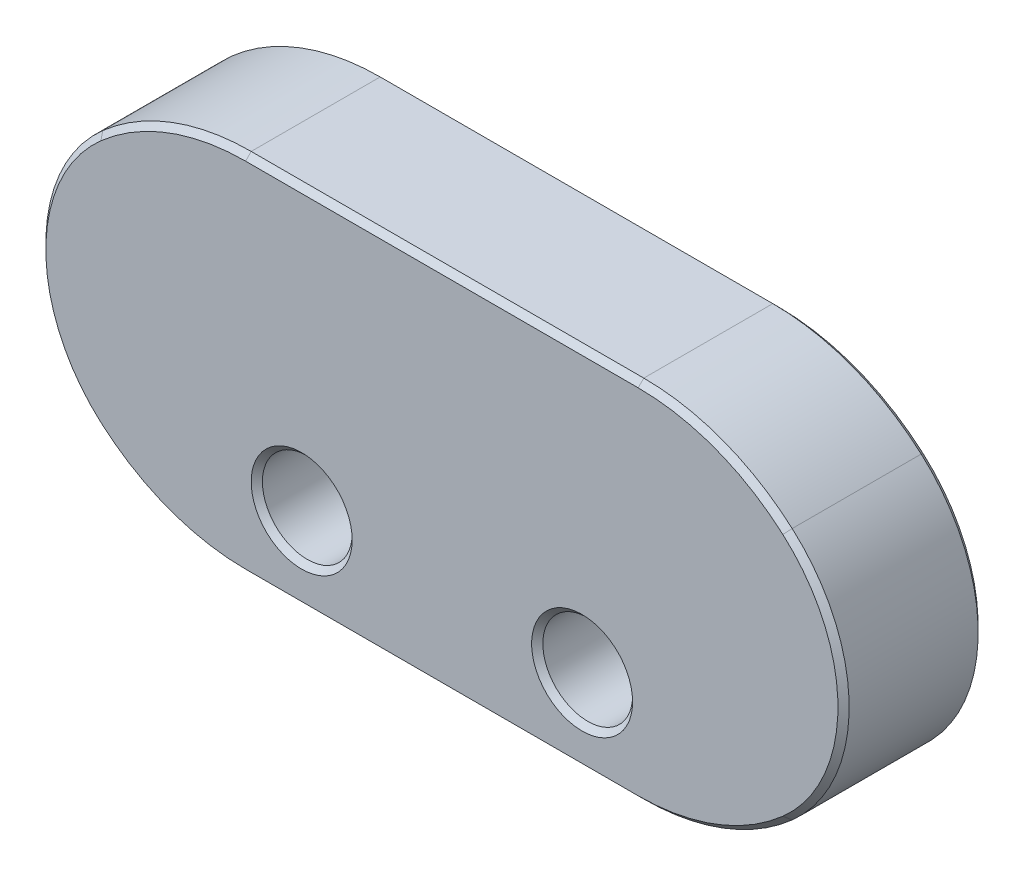
ISO-10303-21;
HEADER;
FILE_DESCRIPTION(('STEP AP214'),'2;1');
FILE_NAME('part.step','',(''),(''),'','','');
FILE_SCHEMA(('AUTOMOTIVE_DESIGN { 1 0 10303 214 1 1 1 1 }'));
ENDSEC;
DATA;
#1=APPLICATION_CONTEXT('core data for automotive mechanical design processes');
#2=APPLICATION_PROTOCOL_DEFINITION('international standard','automotive_design',2000,#1);
#3=PRODUCT_CONTEXT('',#1,'mechanical');
#4=PRODUCT('Part','Part','',(#3));
#5=PRODUCT_RELATED_PRODUCT_CATEGORY('part','',(#4));
#6=PRODUCT_DEFINITION_FORMATION('','',#4);
#7=PRODUCT_DEFINITION_CONTEXT('part definition',#1,'design');
#8=PRODUCT_DEFINITION('design','',#6,#7);
#9=PRODUCT_DEFINITION_SHAPE('','',#8);
#10=(LENGTH_UNIT() NAMED_UNIT(*) SI_UNIT(.MILLI.,.METRE.));
#11=(NAMED_UNIT(*) PLANE_ANGLE_UNIT() SI_UNIT($,.RADIAN.));
#12=(NAMED_UNIT(*) SI_UNIT($,.STERADIAN.) SOLID_ANGLE_UNIT());
#13=UNCERTAINTY_MEASURE_WITH_UNIT(LENGTH_MEASURE(1.E-05),#10,'distance_accuracy_value','');
#14=(GEOMETRIC_REPRESENTATION_CONTEXT(3) GLOBAL_UNCERTAINTY_ASSIGNED_CONTEXT((#13)) GLOBAL_UNIT_ASSIGNED_CONTEXT((#10,
#11,#12)) REPRESENTATION_CONTEXT('',''));
#15=CARTESIAN_POINT('',(0.,0.,0.));
#16=DIRECTION('',(0.,0.,1.));
#17=DIRECTION('',(1.,0.,0.));
#18=AXIS2_PLACEMENT_3D('',#15,#16,#17);
#19=CARTESIAN_POINT('',(0.,-13.,5.));
#20=DIRECTION('',(0.,1.,0.));
#21=DIRECTION('',(0.,0.,1.));
#22=AXIS2_PLACEMENT_3D('',#19,#20,#21);
#23=PLANE('',#22);
#24=DIRECTION('',(0.,0.,-1.));
#25=VECTOR('',#24,1.);
#26=CARTESIAN_POINT('',(22.,-13.,5.));
#27=LINE('',#26,#25);
#28=CARTESIAN_POINT('',(22.,-13.,0.199999999999995));
#29=VERTEX_POINT('',#28);
#30=CARTESIAN_POINT('',(22.,-13.,4.8));
#31=VERTEX_POINT('',#30);
#32=EDGE_CURVE('E322',#29,#31,#27,.F.);
#33=ORIENTED_EDGE('',*,*,#32,.T.);
#34=DIRECTION('',(-1.,0.,0.));
#35=VECTOR('',#34,1.);
#36=CARTESIAN_POINT('',(8.,-13.,4.8));
#37=LINE('',#36,#35);
#38=CARTESIAN_POINT('',(8.,-13.,4.8));
#39=VERTEX_POINT('',#38);
#40=EDGE_CURVE('E156',#31,#39,#37,.T.);
#41=ORIENTED_EDGE('',*,*,#40,.T.);
#42=DIRECTION('',(0.,0.,-1.));
#43=VECTOR('',#42,1.);
#44=CARTESIAN_POINT('',(8.,-13.,5.));
#45=LINE('',#44,#43);
#46=CARTESIAN_POINT('',(8.,-13.,0.199999999999995));
#47=VERTEX_POINT('',#46);
#48=EDGE_CURVE('E327',#39,#47,#45,.T.);
#49=ORIENTED_EDGE('',*,*,#48,.T.);
#50=DIRECTION('',(1.,0.,0.));
#51=VECTOR('',#50,1.);
#52=CARTESIAN_POINT('',(0.,-13.,0.199999999999995));
#53=LINE('',#52,#51);
#54=EDGE_CURVE('E176',#47,#29,#53,.T.);
#55=ORIENTED_EDGE('',*,*,#54,.T.);
#56=EDGE_LOOP('',(#33,#41,#49,#55));
#57=FACE_BOUND('',#56,.T.);
#58=ADVANCED_FACE('F35',(#57),#23,.F.);
#59=CARTESIAN_POINT('',(0.,0.,5.));
#60=DIRECTION('',(0.,-1.,0.));
#61=DIRECTION('',(0.,0.,-1.));
#62=AXIS2_PLACEMENT_3D('',#59,#60,#61);
#63=PLANE('',#62);
#64=DIRECTION('',(0.,0.,-1.));
#65=VECTOR('',#64,1.);
#66=CARTESIAN_POINT('',(8.,0.,5.));
#67=LINE('',#66,#65);
#68=CARTESIAN_POINT('',(8.,0.,0.199999999999995));
#69=VERTEX_POINT('',#68);
#70=CARTESIAN_POINT('',(8.,0.,4.8));
#71=VERTEX_POINT('',#70);
#72=EDGE_CURVE('E320',#69,#71,#67,.F.);
#73=ORIENTED_EDGE('',*,*,#72,.T.);
#74=DIRECTION('',(1.,0.,0.));
#75=VECTOR('',#74,1.);
#76=CARTESIAN_POINT('',(22.,0.,4.8));
#77=LINE('',#76,#75);
#78=CARTESIAN_POINT('',(22.,0.,4.8));
#79=VERTEX_POINT('',#78);
#80=EDGE_CURVE('E199',#71,#79,#77,.T.);
#81=ORIENTED_EDGE('',*,*,#80,.T.);
#82=DIRECTION('',(0.,0.,-1.));
#83=VECTOR('',#82,1.);
#84=CARTESIAN_POINT('',(22.,0.,5.));
#85=LINE('',#84,#83);
#86=CARTESIAN_POINT('',(22.,0.,0.199999999999995));
#87=VERTEX_POINT('',#86);
#88=EDGE_CURVE('E260',#79,#87,#85,.T.);
#89=ORIENTED_EDGE('',*,*,#88,.T.);
#90=DIRECTION('',(-1.,0.,0.));
#91=VECTOR('',#90,1.);
#92=CARTESIAN_POINT('',(0.,0.,0.199999999999995));
#93=LINE('',#92,#91);
#94=EDGE_CURVE('E196',#87,#69,#93,.T.);
#95=ORIENTED_EDGE('',*,*,#94,.T.);
#96=EDGE_LOOP('',(#73,#81,#89,#95));
#97=FACE_BOUND('',#96,.T.);
#98=ADVANCED_FACE('F317',(#97),#63,.F.);
#99=CARTESIAN_POINT('',(0.,0.,5.));
#100=DIRECTION('',(0.,0.,1.));
#101=DIRECTION('',(1.,0.,0.));
#102=AXIS2_PLACEMENT_3D('',#99,#100,#101);
#103=PLANE('',#102);
#104=CARTESIAN_POINT('',(8.,-5.,5.));
#105=DIRECTION('',(0.,0.,1.));
#106=DIRECTION('',(1.,0.,0.));
#107=AXIS2_PLACEMENT_3D('',#104,#105,#106);
#108=CIRCLE('',#107,7.8);
#109=CARTESIAN_POINT('',(2.84078494342405,-10.85,5.));
#110=VERTEX_POINT('',#109);
#111=CARTESIAN_POINT('',(8.,-12.8,5.));
#112=VERTEX_POINT('',#111);
#113=EDGE_CURVE('E174',#110,#112,#108,.T.);
#114=ORIENTED_EDGE('',*,*,#113,.T.);
#115=DIRECTION('',(1.,0.,0.));
#116=VECTOR('',#115,1.);
#117=CARTESIAN_POINT('',(22.,-12.8,5.));
#118=LINE('',#117,#116);
#119=CARTESIAN_POINT('',(22.,-12.8,5.));
#120=VERTEX_POINT('',#119);
#121=EDGE_CURVE('E154',#112,#120,#118,.T.);
#122=ORIENTED_EDGE('',*,*,#121,.T.);
#123=CARTESIAN_POINT('',(22.,-5.,5.));
#124=DIRECTION('',(0.,0.,1.));
#125=DIRECTION('',(1.,0.,0.));
#126=AXIS2_PLACEMENT_3D('',#123,#124,#125);
#127=CIRCLE('',#126,7.8);
#128=CARTESIAN_POINT('',(27.159215056576,-10.85,5.));
#129=VERTEX_POINT('',#128);
#130=EDGE_CURVE('E162',#120,#129,#127,.T.);
#131=ORIENTED_EDGE('',*,*,#130,.T.);
#132=CARTESIAN_POINT('',(23.3228756555323,-6.5,5.));
#133=DIRECTION('',(0.,0.,1.));
#134=DIRECTION('',(1.,0.,0.));
#135=AXIS2_PLACEMENT_3D('',#132,#133,#134);
#136=CIRCLE('',#135,5.8);
#137=CARTESIAN_POINT('',(27.159215056576,-2.15,5.));
#138=VERTEX_POINT('',#137);
#139=EDGE_CURVE('E168',#129,#138,#136,.T.);
#140=ORIENTED_EDGE('',*,*,#139,.T.);
#141=CARTESIAN_POINT('',(22.,-8.,5.));
#142=DIRECTION('',(0.,0.,1.));
#143=DIRECTION('',(1.,0.,0.));
#144=AXIS2_PLACEMENT_3D('',#141,#142,#143);
#145=CIRCLE('',#144,7.8);
#146=CARTESIAN_POINT('',(22.,-0.199999999999999,5.));
#147=VERTEX_POINT('',#146);
#148=EDGE_CURVE('E346',#138,#147,#145,.T.);
#149=ORIENTED_EDGE('',*,*,#148,.T.);
#150=DIRECTION('',(-1.,0.,0.));
#151=VECTOR('',#150,1.);
#152=CARTESIAN_POINT('',(8.,-0.199999999999999,5.));
#153=LINE('',#152,#151);
#154=CARTESIAN_POINT('',(8.,-0.199999999999999,5.));
#155=VERTEX_POINT('',#154);
#156=EDGE_CURVE('E348',#147,#155,#153,.T.);
#157=ORIENTED_EDGE('',*,*,#156,.T.);
#158=CARTESIAN_POINT('',(8.,-8.,5.));
#159=DIRECTION('',(0.,0.,1.));
#160=DIRECTION('',(1.,0.,0.));
#161=AXIS2_PLACEMENT_3D('',#158,#159,#160);
#162=CIRCLE('',#161,7.8);
#163=CARTESIAN_POINT('',(2.84078494342405,-2.15,5.));
#164=VERTEX_POINT('',#163);
#165=EDGE_CURVE('E350',#155,#164,#162,.T.);
#166=ORIENTED_EDGE('',*,*,#165,.T.);
#167=CARTESIAN_POINT('',(6.67712434446771,-6.5,5.));
#168=DIRECTION('',(0.,0.,1.));
#169=DIRECTION('',(1.,0.,0.));
#170=AXIS2_PLACEMENT_3D('',#167,#168,#169);
#171=CIRCLE('',#170,5.8);
#172=EDGE_CURVE('E179',#164,#110,#171,.T.);
#173=ORIENTED_EDGE('',*,*,#172,.T.);
#174=EDGE_LOOP('',(#114,#122,#131,#140,#149,#157,#166,#173));
#175=FACE_BOUND('',#174,.T.);
#176=CARTESIAN_POINT('',(20.,-10.,5.));
#177=DIRECTION('',(0.,0.,1.));
#178=DIRECTION('',(1.,0.,0.));
#179=AXIS2_PLACEMENT_3D('',#176,#177,#178);
#180=CIRCLE('',#179,1.8);
#181=CARTESIAN_POINT('',(21.8,-10.,5.));
#182=VERTEX_POINT('',#181);
#183=EDGE_CURVE('E169',#182,#182,#180,.F.);
#184=ORIENTED_EDGE('',*,*,#183,.T.);
#185=EDGE_LOOP('',(#184));
#186=FACE_BOUND('',#185,.T.);
#187=CARTESIAN_POINT('',(10.,-10.,5.));
#188=DIRECTION('',(0.,0.,1.));
#189=DIRECTION('',(1.,0.,0.));
#190=AXIS2_PLACEMENT_3D('',#187,#188,#189);
#191=CIRCLE('',#190,1.8);
#192=CARTESIAN_POINT('',(11.8,-10.,5.));
#193=VERTEX_POINT('',#192);
#194=EDGE_CURVE('E340',#193,#193,#191,.F.);
#195=ORIENTED_EDGE('',*,*,#194,.T.);
#196=EDGE_LOOP('',(#195));
#197=FACE_BOUND('',#196,.T.);
#198=ADVANCED_FACE('F171',(#175,#186,#197),#103,.T.);
#199=CARTESIAN_POINT('',(0.,0.,0.));
#200=DIRECTION('',(0.,0.,1.));
#201=DIRECTION('',(1.,0.,0.));
#202=AXIS2_PLACEMENT_3D('',#199,#200,#201);
#203=PLANE('',#202);
#204=CARTESIAN_POINT('',(8.,-8.,0.));
#205=DIRECTION('',(0.,0.,1.));
#206=DIRECTION('',(1.,0.,0.));
#207=AXIS2_PLACEMENT_3D('',#204,#205,#206);
#208=CIRCLE('',#207,7.80000000000001);
#209=CARTESIAN_POINT('',(2.84078494342404,-2.15,0.));
#210=VERTEX_POINT('',#209);
#211=CARTESIAN_POINT('',(8.,-0.199999999999994,0.));
#212=VERTEX_POINT('',#211);
#213=EDGE_CURVE('E45',#210,#212,#208,.F.);
#214=ORIENTED_EDGE('',*,*,#213,.T.);
#215=DIRECTION('',(1.,0.,0.));
#216=VECTOR('',#215,1.);
#217=CARTESIAN_POINT('',(0.,-0.199999999999994,0.));
#218=LINE('',#217,#216);
#219=CARTESIAN_POINT('',(22.,-0.199999999999994,0.));
#220=VERTEX_POINT('',#219);
#221=EDGE_CURVE('E11',#212,#220,#218,.T.);
#222=ORIENTED_EDGE('',*,*,#221,.T.);
#223=CARTESIAN_POINT('',(22.,-8.,0.));
#224=DIRECTION('',(0.,0.,1.));
#225=DIRECTION('',(1.,0.,0.));
#226=AXIS2_PLACEMENT_3D('',#223,#224,#225);
#227=CIRCLE('',#226,7.80000000000001);
#228=CARTESIAN_POINT('',(27.159215056576,-2.15,0.));
#229=VERTEX_POINT('',#228);
#230=EDGE_CURVE('E231',#220,#229,#227,.F.);
#231=ORIENTED_EDGE('',*,*,#230,.T.);
#232=CARTESIAN_POINT('',(23.3228756555323,-6.5,0.));
#233=DIRECTION('',(0.,0.,1.));
#234=DIRECTION('',(1.,0.,0.));
#235=AXIS2_PLACEMENT_3D('',#232,#233,#234);
#236=CIRCLE('',#235,5.80000000000001);
#237=CARTESIAN_POINT('',(27.159215056576,-10.85,0.));
#238=VERTEX_POINT('',#237);
#239=EDGE_CURVE('E233',#229,#238,#236,.F.);
#240=ORIENTED_EDGE('',*,*,#239,.T.);
#241=CARTESIAN_POINT('',(22.,-5.,0.));
#242=DIRECTION('',(0.,0.,1.));
#243=DIRECTION('',(1.,0.,0.));
#244=AXIS2_PLACEMENT_3D('',#241,#242,#243);
#245=CIRCLE('',#244,7.80000000000001);
#246=CARTESIAN_POINT('',(22.,-12.8,0.));
#247=VERTEX_POINT('',#246);
#248=EDGE_CURVE('E235',#238,#247,#245,.F.);
#249=ORIENTED_EDGE('',*,*,#248,.T.);
#250=DIRECTION('',(-1.,0.,0.));
#251=VECTOR('',#250,1.);
#252=CARTESIAN_POINT('',(0.,-12.8,0.));
#253=LINE('',#252,#251);
#254=CARTESIAN_POINT('',(8.,-12.8,0.));
#255=VERTEX_POINT('',#254);
#256=EDGE_CURVE('E237',#247,#255,#253,.T.);
#257=ORIENTED_EDGE('',*,*,#256,.T.);
#258=CARTESIAN_POINT('',(8.,-5.,0.));
#259=DIRECTION('',(0.,0.,1.));
#260=DIRECTION('',(1.,0.,0.));
#261=AXIS2_PLACEMENT_3D('',#258,#259,#260);
#262=CIRCLE('',#261,7.80000000000001);
#263=CARTESIAN_POINT('',(2.84078494342405,-10.85,0.));
#264=VERTEX_POINT('',#263);
#265=EDGE_CURVE('E239',#255,#264,#262,.F.);
#266=ORIENTED_EDGE('',*,*,#265,.T.);
#267=CARTESIAN_POINT('',(6.67712434446771,-6.5,0.));
#268=DIRECTION('',(0.,0.,1.));
#269=DIRECTION('',(1.,0.,0.));
#270=AXIS2_PLACEMENT_3D('',#267,#268,#269);
#271=CIRCLE('',#270,5.80000000000001);
#272=EDGE_CURVE('E56',#264,#210,#271,.F.);
#273=ORIENTED_EDGE('',*,*,#272,.T.);
#274=EDGE_LOOP('',(#214,#222,#231,#240,#249,#257,#266,#273));
#275=FACE_BOUND('',#274,.T.);
#276=CARTESIAN_POINT('',(20.,-10.,0.));
#277=DIRECTION('',(0.,0.,1.));
#278=DIRECTION('',(1.,0.,0.));
#279=AXIS2_PLACEMENT_3D('',#276,#277,#278);
#280=CIRCLE('',#279,1.79999999999999);
#281=CARTESIAN_POINT('',(21.8,-10.,0.));
#282=VERTEX_POINT('',#281);
#283=EDGE_CURVE('E228',#282,#282,#280,.T.);
#284=ORIENTED_EDGE('',*,*,#283,.T.);
#285=EDGE_LOOP('',(#284));
#286=FACE_BOUND('',#285,.T.);
#287=CARTESIAN_POINT('',(10.,-10.,0.));
#288=DIRECTION('',(0.,0.,1.));
#289=DIRECTION('',(1.,0.,0.));
#290=AXIS2_PLACEMENT_3D('',#287,#288,#289);
#291=CIRCLE('',#290,1.79999999999999);
#292=CARTESIAN_POINT('',(8.20000000000001,-10.,0.));
#293=VERTEX_POINT('',#292);
#294=EDGE_CURVE('E225',#293,#293,#291,.T.);
#295=ORIENTED_EDGE('',*,*,#294,.T.);
#296=EDGE_LOOP('',(#295));
#297=FACE_BOUND('',#296,.T.);
#298=ADVANCED_FACE('F293',(#275,#286,#297),#203,.F.);
#299=CARTESIAN_POINT('',(20.,-10.,5.));
#300=DIRECTION('',(0.,0.,-1.));
#301=DIRECTION('',(-1.,0.,0.));
#302=AXIS2_PLACEMENT_3D('',#299,#300,#301);
#303=CYLINDRICAL_SURFACE('',#302,1.6);
#304=CARTESIAN_POINT('',(20.,-10.,4.80000000000001));
#305=DIRECTION('',(0.,0.,1.));
#306=DIRECTION('',(1.,0.,0.));
#307=AXIS2_PLACEMENT_3D('',#304,#305,#306);
#308=CIRCLE('',#307,1.6);
#309=CARTESIAN_POINT('',(21.6,-10.,4.80000000000001));
#310=VERTEX_POINT('',#309);
#311=EDGE_CURVE('E216',#310,#310,#308,.T.);
#312=ORIENTED_EDGE('',*,*,#311,.T.);
#313=EDGE_LOOP('',(#312));
#314=FACE_BOUND('',#313,.T.);
#315=CARTESIAN_POINT('',(20.,-10.,0.199999999999993));
#316=DIRECTION('',(0.,0.,1.));
#317=DIRECTION('',(1.,0.,0.));
#318=AXIS2_PLACEMENT_3D('',#315,#316,#317);
#319=CIRCLE('',#318,1.6);
#320=CARTESIAN_POINT('',(21.6,-10.,0.199999999999993));
#321=VERTEX_POINT('',#320);
#322=EDGE_CURVE('E213',#321,#321,#319,.F.);
#323=ORIENTED_EDGE('',*,*,#322,.T.);
#324=EDGE_LOOP('',(#323));
#325=FACE_BOUND('',#324,.T.);
#326=ADVANCED_FACE('F491',(#314,#325),#303,.F.);
#327=CARTESIAN_POINT('',(10.,-10.,5.));
#328=DIRECTION('',(0.,0.,-1.));
#329=DIRECTION('',(-1.,0.,0.));
#330=AXIS2_PLACEMENT_3D('',#327,#328,#329);
#331=CYLINDRICAL_SURFACE('',#330,1.6);
#332=CARTESIAN_POINT('',(10.,-10.,4.80000000000001));
#333=DIRECTION('',(0.,0.,1.));
#334=DIRECTION('',(1.,0.,0.));
#335=AXIS2_PLACEMENT_3D('',#332,#333,#334);
#336=CIRCLE('',#335,1.6);
#337=CARTESIAN_POINT('',(8.4,-10.,4.80000000000001));
#338=VERTEX_POINT('',#337);
#339=EDGE_CURVE('E222',#338,#338,#336,.T.);
#340=CARTESIAN_POINT('',(10.,-10.,0.199999999999994));
#341=DIRECTION('',(0.,0.,1.));
#342=DIRECTION('',(1.,0.,0.));
#343=AXIS2_PLACEMENT_3D('',#340,#341,#342);
#344=CIRCLE('',#343,1.6);
#345=CARTESIAN_POINT('',(8.4,-10.,0.199999999999994));
#346=VERTEX_POINT('',#345);
#347=EDGE_CURVE('E219',#346,#346,#344,.F.);
#348=CARTESIAN_POINT('',(8.4,-10.,4.80000000000001));
#349=CARTESIAN_POINT('',(8.4,-10.,4.75208333333334));
#350=CARTESIAN_POINT('',(8.4,-10.,4.70416666666667));
#351=CARTESIAN_POINT('',(8.4,-10.,4.60833333333334));
#352=CARTESIAN_POINT('',(8.4,-10.,4.56041666666667));
#353=CARTESIAN_POINT('',(8.4,-10.,4.46458333333334));
#354=CARTESIAN_POINT('',(8.4,-10.,4.41666666666667));
#355=CARTESIAN_POINT('',(8.4,-10.,4.32083333333334));
#356=CARTESIAN_POINT('',(8.4,-10.,4.27291666666667));
#357=CARTESIAN_POINT('',(8.4,-10.,4.17708333333334));
#358=CARTESIAN_POINT('',(8.4,-10.,4.12916666666667));
#359=CARTESIAN_POINT('',(8.4,-10.,4.03333333333334));
#360=CARTESIAN_POINT('',(8.4,-10.,3.98541666666667));
#361=CARTESIAN_POINT('',(8.4,-10.,3.88958333333334));
#362=CARTESIAN_POINT('',(8.4,-10.,3.84166666666667));
#363=CARTESIAN_POINT('',(8.4,-10.,3.74583333333334));
#364=CARTESIAN_POINT('',(8.4,-10.,3.69791666666667));
#365=CARTESIAN_POINT('',(8.4,-10.,3.60208333333334));
#366=CARTESIAN_POINT('',(8.4,-10.,3.55416666666667));
#367=CARTESIAN_POINT('',(8.4,-10.,3.45833333333334));
#368=CARTESIAN_POINT('',(8.4,-10.,3.41041666666667));
#369=CARTESIAN_POINT('',(8.4,-10.,3.31458333333333));
#370=CARTESIAN_POINT('',(8.4,-10.,3.26666666666667));
#371=CARTESIAN_POINT('',(8.4,-10.,3.17083333333334));
#372=CARTESIAN_POINT('',(8.4,-10.,3.12291666666667));
#373=CARTESIAN_POINT('',(8.4,-10.,3.02708333333333));
#374=CARTESIAN_POINT('',(8.4,-10.,2.97916666666667));
#375=CARTESIAN_POINT('',(8.4,-10.,2.88333333333333));
#376=CARTESIAN_POINT('',(8.4,-10.,2.83541666666667));
#377=CARTESIAN_POINT('',(8.4,-10.,2.73958333333333));
#378=CARTESIAN_POINT('',(8.4,-10.,2.69166666666667));
#379=CARTESIAN_POINT('',(8.4,-10.,2.59583333333333));
#380=CARTESIAN_POINT('',(8.4,-10.,2.54791666666667));
#381=CARTESIAN_POINT('',(8.4,-10.,2.45208333333333));
#382=CARTESIAN_POINT('',(8.4,-10.,2.40416666666667));
#383=CARTESIAN_POINT('',(8.4,-10.,2.30833333333333));
#384=CARTESIAN_POINT('',(8.4,-10.,2.26041666666667));
#385=CARTESIAN_POINT('',(8.4,-10.,2.16458333333333));
#386=CARTESIAN_POINT('',(8.4,-10.,2.11666666666667));
#387=CARTESIAN_POINT('',(8.4,-10.,2.02083333333333));
#388=CARTESIAN_POINT('',(8.4,-10.,1.97291666666667));
#389=CARTESIAN_POINT('',(8.4,-10.,1.87708333333333));
#390=CARTESIAN_POINT('',(8.4,-10.,1.82916666666667));
#391=CARTESIAN_POINT('',(8.4,-10.,1.73333333333333));
#392=CARTESIAN_POINT('',(8.4,-10.,1.68541666666666));
#393=CARTESIAN_POINT('',(8.4,-10.,1.58958333333333));
#394=CARTESIAN_POINT('',(8.4,-10.,1.54166666666666));
#395=CARTESIAN_POINT('',(8.4,-10.,1.44583333333333));
#396=CARTESIAN_POINT('',(8.4,-10.,1.39791666666666));
#397=CARTESIAN_POINT('',(8.4,-10.,1.30208333333333));
#398=CARTESIAN_POINT('',(8.4,-10.,1.25416666666666));
#399=CARTESIAN_POINT('',(8.4,-10.,1.15833333333333));
#400=CARTESIAN_POINT('',(8.4,-10.,1.11041666666666));
#401=CARTESIAN_POINT('',(8.4,-10.,1.01458333333333));
#402=CARTESIAN_POINT('',(8.4,-10.,0.966666666666663));
#403=CARTESIAN_POINT('',(8.4,-10.,0.87083333333333));
#404=CARTESIAN_POINT('',(8.4,-10.,0.822916666666662));
#405=CARTESIAN_POINT('',(8.4,-10.,0.727083333333329));
#406=CARTESIAN_POINT('',(8.4,-10.,0.679166666666662));
#407=CARTESIAN_POINT('',(8.4,-10.,0.583333333333329));
#408=CARTESIAN_POINT('',(8.4,-10.,0.535416666666662));
#409=CARTESIAN_POINT('',(8.4,-10.,0.439583333333329));
#410=CARTESIAN_POINT('',(8.4,-10.,0.391666666666663));
#411=CARTESIAN_POINT('',(8.4,-10.,0.295833333333329));
#412=CARTESIAN_POINT('',(8.4,-10.,0.247916666666662));
#413=CARTESIAN_POINT('',(8.4,-10.,0.199999999999994));
#414=B_SPLINE_CURVE_WITH_KNOTS('',3,(#348,#349,#350,#351,#352,#353,#354,#355,#356,#357,#358,
#359,#360,#361,#362,#363,#364,#365,#366,#367,#368,#369,#370,#371,#372,#373,#374,#375,#376,#377,
#378,#379,#380,#381,#382,#383,#384,#385,#386,#387,#388,#389,#390,#391,#392,#393,#394,#395,#396,
#397,#398,#399,#400,#401,#402,#403,#404,#405,#406,#407,#408,#409,#410,#411,#412,#413),
.UNSPECIFIED.,.F.,.F.,(4,2,2,2,2,2,2,2,2,2,2,2,2,2,2,2,2,2,2,2,2,2,2,2,2,2,2,2,2,2,2,2,4),(0.,
0.143750000000001,0.287500000000001,0.431250000000001,0.575000000000002,0.718750000000002,
0.862500000000002,1.00625,1.15,1.29375,1.4375,1.58125,1.725,1.86875,2.01250000000001,
2.15625000000001,2.30000000000001,2.44375000000001,2.58750000000001,2.73125000000001,
2.87500000000001,3.01875000000001,3.16250000000001,3.30625000000001,3.45000000000001,
3.59375000000001,3.73750000000001,3.88125000000001,4.02500000000001,4.16875000000001,
4.31250000000001,4.45625000000001,4.60000000000001),.UNSPECIFIED.);
#415=EDGE_CURVE('BSEAM402',#338,#346,#414,.T.);
#416=ORIENTED_EDGE('',*,*,#339,.T.);
#417=ORIENTED_EDGE('',*,*,#347,.T.);
#418=ORIENTED_EDGE('',*,*,#415,.T.);
#419=ORIENTED_EDGE('',*,*,#415,.F.);
#420=EDGE_LOOP('',(#416,#418,#417,#419));
#421=FACE_BOUND('',#420,.T.);
#422=ADVANCED_FACE('F402',(#421),#331,.F.);
#423=CARTESIAN_POINT('',(8.,-5.,5.));
#424=DIRECTION('',(0.,0.,-1.));
#425=DIRECTION('',(-1.,0.,0.));
#426=AXIS2_PLACEMENT_3D('',#423,#424,#425);
#427=CYLINDRICAL_SURFACE('',#426,8.);
#428=ORIENTED_EDGE('',*,*,#48,.F.);
#429=CARTESIAN_POINT('',(8.,-5.,4.8));
#430=DIRECTION('',(0.,0.,1.));
#431=DIRECTION('',(1.,0.,0.));
#432=AXIS2_PLACEMENT_3D('',#429,#430,#431);
#433=CIRCLE('',#432,8.);
#434=CARTESIAN_POINT('',(2.70849737787082,-11.,4.8));
#435=VERTEX_POINT('',#434);
#436=EDGE_CURVE('E186',#39,#435,#433,.F.);
#437=ORIENTED_EDGE('',*,*,#436,.T.);
#438=DIRECTION('',(0.,0.,-1.));
#439=VECTOR('',#438,1.);
#440=CARTESIAN_POINT('',(2.70849737787082,-11.,5.));
#441=LINE('',#440,#439);
#442=CARTESIAN_POINT('',(2.70849737787082,-11.,0.199999999999995));
#443=VERTEX_POINT('',#442);
#444=EDGE_CURVE('E337',#435,#443,#441,.T.);
#445=ORIENTED_EDGE('',*,*,#444,.T.);
#446=CARTESIAN_POINT('',(8.,-5.,0.199999999999995));
#447=DIRECTION('',(0.,0.,1.));
#448=DIRECTION('',(1.,0.,0.));
#449=AXIS2_PLACEMENT_3D('',#446,#447,#448);
#450=CIRCLE('',#449,8.);
#451=EDGE_CURVE('E184',#443,#47,#450,.T.);
#452=ORIENTED_EDGE('',*,*,#451,.T.);
#453=EDGE_LOOP('',(#428,#437,#445,#452));
#454=FACE_BOUND('',#453,.T.);
#455=ADVANCED_FACE('F366',(#454),#427,.T.);
#456=CARTESIAN_POINT('',(8.,-8.,5.));
#457=DIRECTION('',(0.,0.,-1.));
#458=DIRECTION('',(-1.,0.,0.));
#459=AXIS2_PLACEMENT_3D('',#456,#457,#458);
#460=CYLINDRICAL_SURFACE('',#459,8.);
#461=DIRECTION('',(0.,0.,-1.));
#462=VECTOR('',#461,1.);
#463=CARTESIAN_POINT('',(2.70849737787082,-2.,5.));
#464=LINE('',#463,#462);
#465=CARTESIAN_POINT('',(2.70849737787082,-2.,0.199999999999995));
#466=VERTEX_POINT('',#465);
#467=CARTESIAN_POINT('',(2.70849737787082,-2.,4.8));
#468=VERTEX_POINT('',#467);
#469=EDGE_CURVE('E334',#466,#468,#464,.F.);
#470=ORIENTED_EDGE('',*,*,#469,.T.);
#471=CARTESIAN_POINT('',(8.,-8.,4.8));
#472=DIRECTION('',(0.,0.,1.));
#473=DIRECTION('',(1.,0.,0.));
#474=AXIS2_PLACEMENT_3D('',#471,#472,#473);
#475=CIRCLE('',#474,8.);
#476=EDGE_CURVE('E194',#468,#71,#475,.F.);
#477=ORIENTED_EDGE('',*,*,#476,.T.);
#478=ORIENTED_EDGE('',*,*,#72,.F.);
#479=CARTESIAN_POINT('',(8.,-8.,0.199999999999995));
#480=DIRECTION('',(0.,0.,1.));
#481=DIRECTION('',(1.,0.,0.));
#482=AXIS2_PLACEMENT_3D('',#479,#480,#481);
#483=CIRCLE('',#482,8.);
#484=EDGE_CURVE('E192',#69,#466,#483,.T.);
#485=ORIENTED_EDGE('',*,*,#484,.T.);
#486=EDGE_LOOP('',(#470,#477,#478,#485));
#487=FACE_BOUND('',#486,.T.);
#488=ADVANCED_FACE('F396',(#487),#460,.T.);
#489=CARTESIAN_POINT('',(22.,-8.,5.));
#490=DIRECTION('',(0.,0.,-1.));
#491=DIRECTION('',(-1.,0.,0.));
#492=AXIS2_PLACEMENT_3D('',#489,#490,#491);
#493=CYLINDRICAL_SURFACE('',#492,8.);
#494=ORIENTED_EDGE('',*,*,#88,.F.);
#495=CARTESIAN_POINT('',(22.,-8.,4.8));
#496=DIRECTION('',(0.,0.,1.));
#497=DIRECTION('',(1.,0.,0.));
#498=AXIS2_PLACEMENT_3D('',#495,#496,#497);
#499=CIRCLE('',#498,8.);
#500=CARTESIAN_POINT('',(27.2915026221292,-2.,4.8));
#501=VERTEX_POINT('',#500);
#502=EDGE_CURVE('E203',#79,#501,#499,.F.);
#503=ORIENTED_EDGE('',*,*,#502,.T.);
#504=DIRECTION('',(0.,0.,-1.));
#505=VECTOR('',#504,1.);
#506=CARTESIAN_POINT('',(27.2915026221292,-2.,5.));
#507=LINE('',#506,#505);
#508=CARTESIAN_POINT('',(27.2915026221292,-2.,0.199999999999995));
#509=VERTEX_POINT('',#508);
#510=EDGE_CURVE('E314',#501,#509,#507,.T.);
#511=ORIENTED_EDGE('',*,*,#510,.T.);
#512=CARTESIAN_POINT('',(22.,-8.,0.199999999999995));
#513=DIRECTION('',(0.,0.,1.));
#514=DIRECTION('',(1.,0.,0.));
#515=AXIS2_PLACEMENT_3D('',#512,#513,#514);
#516=CIRCLE('',#515,8.);
#517=EDGE_CURVE('E201',#509,#87,#516,.T.);
#518=ORIENTED_EDGE('',*,*,#517,.T.);
#519=EDGE_LOOP('',(#494,#503,#511,#518));
#520=FACE_BOUND('',#519,.T.);
#521=ADVANCED_FACE('F311',(#520),#493,.T.);
#522=CARTESIAN_POINT('',(22.,-5.,5.));
#523=DIRECTION('',(0.,0.,-1.));
#524=DIRECTION('',(-1.,0.,0.));
#525=AXIS2_PLACEMENT_3D('',#522,#523,#524);
#526=CYLINDRICAL_SURFACE('',#525,8.);
#527=DIRECTION('',(0.,0.,-1.));
#528=VECTOR('',#527,1.);
#529=CARTESIAN_POINT('',(27.2915026221292,-11.,5.));
#530=LINE('',#529,#528);
#531=CARTESIAN_POINT('',(27.2915026221292,-11.,0.199999999999995));
#532=VERTEX_POINT('',#531);
#533=CARTESIAN_POINT('',(27.2915026221292,-11.,4.8));
#534=VERTEX_POINT('',#533);
#535=EDGE_CURVE('E330',#532,#534,#530,.F.);
#536=ORIENTED_EDGE('',*,*,#535,.T.);
#537=CARTESIAN_POINT('',(22.,-5.,4.8));
#538=DIRECTION('',(0.,0.,1.));
#539=DIRECTION('',(1.,0.,0.));
#540=AXIS2_PLACEMENT_3D('',#537,#538,#539);
#541=CIRCLE('',#540,8.);
#542=EDGE_CURVE('E211',#534,#31,#541,.F.);
#543=ORIENTED_EDGE('',*,*,#542,.T.);
#544=ORIENTED_EDGE('',*,*,#32,.F.);
#545=CARTESIAN_POINT('',(22.,-5.,0.199999999999995));
#546=DIRECTION('',(0.,0.,1.));
#547=DIRECTION('',(1.,0.,0.));
#548=AXIS2_PLACEMENT_3D('',#545,#546,#547);
#549=CIRCLE('',#548,8.);
#550=EDGE_CURVE('E209',#29,#532,#549,.T.);
#551=ORIENTED_EDGE('',*,*,#550,.T.);
#552=EDGE_LOOP('',(#536,#543,#544,#551));
#553=FACE_BOUND('',#552,.T.);
#554=ADVANCED_FACE('F403',(#553),#526,.T.);
#555=CARTESIAN_POINT('',(23.3228756555323,-6.5,5.));
#556=DIRECTION('',(0.,0.,1.));
#557=DIRECTION('',(1.,0.,0.));
#558=AXIS2_PLACEMENT_3D('',#555,#556,#557);
#559=CYLINDRICAL_SURFACE('',#558,6.);
#560=ORIENTED_EDGE('',*,*,#510,.F.);
#561=CARTESIAN_POINT('',(23.3228756555323,-6.5,4.8));
#562=DIRECTION('',(0.,0.,1.));
#563=DIRECTION('',(1.,0.,0.));
#564=AXIS2_PLACEMENT_3D('',#561,#562,#563);
#565=CIRCLE('',#564,6.);
#566=EDGE_CURVE('E207',#501,#534,#565,.F.);
#567=ORIENTED_EDGE('',*,*,#566,.T.);
#568=ORIENTED_EDGE('',*,*,#535,.F.);
#569=CARTESIAN_POINT('',(23.3228756555323,-6.5,0.199999999999995));
#570=DIRECTION('',(0.,0.,1.));
#571=DIRECTION('',(1.,0.,0.));
#572=AXIS2_PLACEMENT_3D('',#569,#570,#571);
#573=CIRCLE('',#572,6.);
#574=EDGE_CURVE('E205',#532,#509,#573,.T.);
#575=ORIENTED_EDGE('',*,*,#574,.T.);
#576=EDGE_LOOP('',(#560,#567,#568,#575));
#577=FACE_BOUND('',#576,.T.);
#578=ADVANCED_FACE('F406',(#577),#559,.T.);
#579=CARTESIAN_POINT('',(6.67712434446771,-6.5,5.));
#580=DIRECTION('',(0.,0.,1.));
#581=DIRECTION('',(1.,0.,0.));
#582=AXIS2_PLACEMENT_3D('',#579,#580,#581);
#583=CYLINDRICAL_SURFACE('',#582,6.);
#584=ORIENTED_EDGE('',*,*,#444,.F.);
#585=CARTESIAN_POINT('',(6.67712434446771,-6.5,4.8));
#586=DIRECTION('',(0.,0.,1.));
#587=DIRECTION('',(1.,0.,0.));
#588=AXIS2_PLACEMENT_3D('',#585,#586,#587);
#589=CIRCLE('',#588,6.);
#590=EDGE_CURVE('E190',#435,#468,#589,.F.);
#591=ORIENTED_EDGE('',*,*,#590,.T.);
#592=ORIENTED_EDGE('',*,*,#469,.F.);
#593=CARTESIAN_POINT('',(6.67712434446771,-6.5,0.199999999999995));
#594=DIRECTION('',(0.,0.,1.));
#595=DIRECTION('',(1.,0.,0.));
#596=AXIS2_PLACEMENT_3D('',#593,#594,#595);
#597=CIRCLE('',#596,6.);
#598=EDGE_CURVE('E188',#466,#443,#597,.T.);
#599=ORIENTED_EDGE('',*,*,#598,.T.);
#600=EDGE_LOOP('',(#584,#591,#592,#599));
#601=FACE_BOUND('',#600,.T.);
#602=ADVANCED_FACE('F412',(#601),#583,.T.);
#603=CARTESIAN_POINT('',(0.,-0.199999999999999,5.));
#604=DIRECTION('',(0.,0.707106781186548,0.707106781186548));
#605=DIRECTION('',(1.,0.,0.));
#606=AXIS2_PLACEMENT_3D('',#603,#604,#605);
#607=PLANE('',#606);
#608=DIRECTION('',(0.,-0.707106781186548,0.707106781186548));
#609=VECTOR('',#608,1.);
#610=CARTESIAN_POINT('',(22.,0.,4.8));
#611=LINE('',#610,#609);
#612=EDGE_CURVE('E254',#79,#147,#611,.T.);
#613=ORIENTED_EDGE('',*,*,#612,.F.);
#614=ORIENTED_EDGE('',*,*,#80,.F.);
#615=DIRECTION('',(0.,0.707106781186548,-0.707106781186548));
#616=VECTOR('',#615,1.);
#617=CARTESIAN_POINT('',(8.,-0.199999999999999,5.));
#618=LINE('',#617,#616);
#619=EDGE_CURVE('E257',#155,#71,#618,.T.);
#620=ORIENTED_EDGE('',*,*,#619,.F.);
#621=ORIENTED_EDGE('',*,*,#156,.F.);
#622=EDGE_LOOP('',(#613,#614,#620,#621));
#623=FACE_BOUND('',#622,.T.);
#624=ADVANCED_FACE('F416',(#623),#607,.T.);
#625=CARTESIAN_POINT('',(8.,-8.,5.));
#626=DIRECTION('',(0.,0.,-1.));
#627=DIRECTION('',(-1.,0.,0.));
#628=AXIS2_PLACEMENT_3D('',#625,#626,#627);
#629=CONICAL_SURFACE('',#628,7.8,0.785398163397448);
#630=ORIENTED_EDGE('',*,*,#619,.T.);
#631=ORIENTED_EDGE('',*,*,#476,.F.);
#632=DIRECTION('',(-0.467707173346743,0.53033008588991,-0.707106781186547));
#633=VECTOR('',#632,1.);
#634=CARTESIAN_POINT('',(2.84078494342405,-2.15,5.));
#635=LINE('',#634,#633);
#636=EDGE_CURVE('E251',#164,#468,#635,.T.);
#637=ORIENTED_EDGE('',*,*,#636,.F.);
#638=ORIENTED_EDGE('',*,*,#165,.F.);
#639=EDGE_LOOP('',(#630,#631,#637,#638));
#640=FACE_BOUND('',#639,.T.);
#641=ADVANCED_FACE('F454',(#640),#629,.T.);
#642=CARTESIAN_POINT('',(22.,-8.,5.));
#643=DIRECTION('',(0.,0.,-1.));
#644=DIRECTION('',(-1.,0.,0.));
#645=AXIS2_PLACEMENT_3D('',#642,#643,#644);
#646=CONICAL_SURFACE('',#645,7.8,0.785398163397448);
#647=ORIENTED_EDGE('',*,*,#612,.T.);
#648=ORIENTED_EDGE('',*,*,#148,.F.);
#649=DIRECTION('',(-0.467707173346739,-0.530330085889912,0.707106781186549));
#650=VECTOR('',#649,1.);
#651=CARTESIAN_POINT('',(27.2915026221292,-2.,4.8));
#652=LINE('',#651,#650);
#653=EDGE_CURVE('E248',#501,#138,#652,.T.);
#654=ORIENTED_EDGE('',*,*,#653,.F.);
#655=ORIENTED_EDGE('',*,*,#502,.F.);
#656=EDGE_LOOP('',(#647,#648,#654,#655));
#657=FACE_BOUND('',#656,.T.);
#658=ADVANCED_FACE('F448',(#657),#646,.T.);
#659=CARTESIAN_POINT('',(6.67712434446771,-6.5,5.));
#660=DIRECTION('',(0.,0.,-1.));
#661=DIRECTION('',(-1.,0.,0.));
#662=AXIS2_PLACEMENT_3D('',#659,#660,#661);
#663=CONICAL_SURFACE('',#662,5.8,0.785398163397446);
#664=ORIENTED_EDGE('',*,*,#636,.T.);
#665=ORIENTED_EDGE('',*,*,#590,.F.);
#666=DIRECTION('',(-0.467707173346741,-0.530330085889907,-0.707106781186551));
#667=VECTOR('',#666,1.);
#668=CARTESIAN_POINT('',(2.84078494342405,-10.85,5.));
#669=LINE('',#668,#667);
#670=EDGE_CURVE('E245',#110,#435,#669,.T.);
#671=ORIENTED_EDGE('',*,*,#670,.F.);
#672=ORIENTED_EDGE('',*,*,#172,.F.);
#673=EDGE_LOOP('',(#664,#665,#671,#672));
#674=FACE_BOUND('',#673,.T.);
#675=ADVANCED_FACE('F357',(#674),#663,.T.);
#676=CARTESIAN_POINT('',(23.3228756555323,-6.5,5.));
#677=DIRECTION('',(0.,0.,-1.));
#678=DIRECTION('',(-1.,0.,0.));
#679=AXIS2_PLACEMENT_3D('',#676,#677,#678);
#680=CONICAL_SURFACE('',#679,5.8,0.785398163397448);
#681=ORIENTED_EDGE('',*,*,#653,.T.);
#682=ORIENTED_EDGE('',*,*,#139,.F.);
#683=DIRECTION('',(-0.467707173346739,0.530330085889912,0.707106781186549));
#684=VECTOR('',#683,1.);
#685=CARTESIAN_POINT('',(27.2915026221292,-11.,4.8));
#686=LINE('',#685,#684);
#687=EDGE_CURVE('E165',#534,#129,#686,.T.);
#688=ORIENTED_EDGE('',*,*,#687,.F.);
#689=ORIENTED_EDGE('',*,*,#566,.F.);
#690=EDGE_LOOP('',(#681,#682,#688,#689));
#691=FACE_BOUND('',#690,.T.);
#692=ADVANCED_FACE('F436',(#691),#680,.T.);
#693=CARTESIAN_POINT('',(8.,-5.,5.));
#694=DIRECTION('',(0.,0.,-1.));
#695=DIRECTION('',(-1.,0.,0.));
#696=AXIS2_PLACEMENT_3D('',#693,#694,#695);
#697=CONICAL_SURFACE('',#696,7.8,0.785398163397448);
#698=ORIENTED_EDGE('',*,*,#670,.T.);
#699=ORIENTED_EDGE('',*,*,#436,.F.);
#700=DIRECTION('',(0.,-0.707106781186548,-0.707106781186548));
#701=VECTOR('',#700,1.);
#702=CARTESIAN_POINT('',(8.,-12.8,5.));
#703=LINE('',#702,#701);
#704=EDGE_CURVE('E159',#112,#39,#703,.T.);
#705=ORIENTED_EDGE('',*,*,#704,.F.);
#706=ORIENTED_EDGE('',*,*,#113,.F.);
#707=EDGE_LOOP('',(#698,#699,#705,#706));
#708=FACE_BOUND('',#707,.T.);
#709=ADVANCED_FACE('F360',(#708),#697,.T.);
#710=CARTESIAN_POINT('',(22.,-5.,5.));
#711=DIRECTION('',(0.,0.,-1.));
#712=DIRECTION('',(-1.,0.,0.));
#713=AXIS2_PLACEMENT_3D('',#710,#711,#712);
#714=CONICAL_SURFACE('',#713,7.8,0.785398163397448);
#715=ORIENTED_EDGE('',*,*,#687,.T.);
#716=ORIENTED_EDGE('',*,*,#130,.F.);
#717=DIRECTION('',(0.,0.707106781186548,0.707106781186548));
#718=VECTOR('',#717,1.);
#719=CARTESIAN_POINT('',(22.,-13.,4.8));
#720=LINE('',#719,#718);
#721=EDGE_CURVE('E150',#31,#120,#720,.T.);
#722=ORIENTED_EDGE('',*,*,#721,.F.);
#723=ORIENTED_EDGE('',*,*,#542,.F.);
#724=EDGE_LOOP('',(#715,#716,#722,#723));
#725=FACE_BOUND('',#724,.T.);
#726=ADVANCED_FACE('F163',(#725),#714,.T.);
#727=CARTESIAN_POINT('',(0.,-12.8,5.));
#728=DIRECTION('',(0.,-0.707106781186548,0.707106781186548));
#729=DIRECTION('',(-1.,0.,0.));
#730=AXIS2_PLACEMENT_3D('',#727,#728,#729);
#731=PLANE('',#730);
#732=ORIENTED_EDGE('',*,*,#704,.T.);
#733=ORIENTED_EDGE('',*,*,#40,.F.);
#734=ORIENTED_EDGE('',*,*,#721,.T.);
#735=ORIENTED_EDGE('',*,*,#121,.F.);
#736=EDGE_LOOP('',(#732,#733,#734,#735));
#737=FACE_BOUND('',#736,.T.);
#738=ADVANCED_FACE('F152',(#737),#731,.T.);
#739=CARTESIAN_POINT('',(20.,-10.,5.));
#740=DIRECTION('',(0.,0.,1.));
#741=DIRECTION('',(1.,0.,0.));
#742=AXIS2_PLACEMENT_3D('',#739,#740,#741);
#743=CONICAL_SURFACE('',#742,1.8,0.785398163397452);
#744=ORIENTED_EDGE('',*,*,#311,.F.);
#745=EDGE_LOOP('',(#744));
#746=FACE_BOUND('',#745,.T.);
#747=ORIENTED_EDGE('',*,*,#183,.F.);
#748=EDGE_LOOP('',(#747));
#749=FACE_BOUND('',#748,.T.);
#750=ADVANCED_FACE('F425',(#746,#749),#743,.F.);
#751=CARTESIAN_POINT('',(10.,-10.,5.));
#752=DIRECTION('',(0.,0.,1.));
#753=DIRECTION('',(1.,0.,0.));
#754=AXIS2_PLACEMENT_3D('',#751,#752,#753);
#755=CONICAL_SURFACE('',#754,1.8,0.785398163397452);
#756=ORIENTED_EDGE('',*,*,#339,.F.);
#757=EDGE_LOOP('',(#756));
#758=FACE_BOUND('',#757,.T.);
#759=ORIENTED_EDGE('',*,*,#194,.F.);
#760=EDGE_LOOP('',(#759));
#761=FACE_BOUND('',#760,.T.);
#762=ADVANCED_FACE('F471',(#758,#761),#755,.F.);
#763=CARTESIAN_POINT('',(0.,-13.,0.199999999999995));
#764=DIRECTION('',(0.,0.707106781186551,0.707106781186544));
#765=DIRECTION('',(1.,0.,0.));
#766=AXIS2_PLACEMENT_3D('',#763,#764,#765);
#767=PLANE('',#766);
#768=DIRECTION('',(0.,-0.707106781186544,0.707106781186551));
#769=VECTOR('',#768,1.);
#770=CARTESIAN_POINT('',(8.,-12.8,0.));
#771=LINE('',#770,#769);
#772=EDGE_CURVE('E276',#255,#47,#771,.T.);
#773=ORIENTED_EDGE('',*,*,#772,.F.);
#774=ORIENTED_EDGE('',*,*,#256,.F.);
#775=DIRECTION('',(0.,0.707106781186544,-0.707106781186551));
#776=VECTOR('',#775,1.);
#777=CARTESIAN_POINT('',(22.,-13.,0.199999999999995));
#778=LINE('',#777,#776);
#779=EDGE_CURVE('E40',#29,#247,#778,.T.);
#780=ORIENTED_EDGE('',*,*,#779,.F.);
#781=ORIENTED_EDGE('',*,*,#54,.F.);
#782=EDGE_LOOP('',(#773,#774,#780,#781));
#783=FACE_BOUND('',#782,.T.);
#784=ADVANCED_FACE('F292',(#783),#767,.F.);
#785=CARTESIAN_POINT('',(22.,-5.,0.));
#786=DIRECTION('',(0.,0.,1.));
#787=DIRECTION('',(1.,0.,0.));
#788=AXIS2_PLACEMENT_3D('',#785,#786,#787);
#789=CONICAL_SURFACE('',#788,7.80000000000001,0.785398163397444);
#790=ORIENTED_EDGE('',*,*,#779,.T.);
#791=ORIENTED_EDGE('',*,*,#248,.F.);
#792=DIRECTION('',(-0.467707173346737,0.53033008588991,-0.707106781186551));
#793=VECTOR('',#792,1.);
#794=CARTESIAN_POINT('',(27.2915026221292,-11.,0.199999999999995));
#795=LINE('',#794,#793);
#796=EDGE_CURVE('E274',#532,#238,#795,.T.);
#797=ORIENTED_EDGE('',*,*,#796,.F.);
#798=ORIENTED_EDGE('',*,*,#550,.F.);
#799=EDGE_LOOP('',(#790,#791,#797,#798));
#800=FACE_BOUND('',#799,.T.);
#801=ADVANCED_FACE('F287',(#800),#789,.T.);
#802=CARTESIAN_POINT('',(8.,-5.,0.));
#803=DIRECTION('',(0.,0.,1.));
#804=DIRECTION('',(1.,0.,0.));
#805=AXIS2_PLACEMENT_3D('',#802,#803,#804);
#806=CONICAL_SURFACE('',#805,7.80000000000001,0.785398163397444);
#807=ORIENTED_EDGE('',*,*,#772,.T.);
#808=ORIENTED_EDGE('',*,*,#451,.F.);
#809=DIRECTION('',(-0.467707173346741,-0.530330085889909,0.70710678118655));
#810=VECTOR('',#809,1.);
#811=CARTESIAN_POINT('',(2.84078494342405,-10.85,0.));
#812=LINE('',#811,#810);
#813=EDGE_CURVE('E271',#264,#443,#812,.T.);
#814=ORIENTED_EDGE('',*,*,#813,.F.);
#815=ORIENTED_EDGE('',*,*,#265,.F.);
#816=EDGE_LOOP('',(#807,#808,#814,#815));
#817=FACE_BOUND('',#816,.T.);
#818=ADVANCED_FACE('F367',(#817),#806,.T.);
#819=CARTESIAN_POINT('',(23.3228756555323,-6.5,0.));
#820=DIRECTION('',(0.,0.,1.));
#821=DIRECTION('',(1.,0.,0.));
#822=AXIS2_PLACEMENT_3D('',#819,#820,#821);
#823=CONICAL_SURFACE('',#822,5.80000000000001,0.785398163397444);
#824=ORIENTED_EDGE('',*,*,#796,.T.);
#825=ORIENTED_EDGE('',*,*,#239,.F.);
#826=DIRECTION('',(-0.467707173346737,-0.53033008588991,-0.707106781186551));
#827=VECTOR('',#826,1.);
#828=CARTESIAN_POINT('',(27.2915026221292,-2.,0.199999999999995));
#829=LINE('',#828,#827);
#830=EDGE_CURVE('E268',#509,#229,#829,.T.);
#831=ORIENTED_EDGE('',*,*,#830,.F.);
#832=ORIENTED_EDGE('',*,*,#574,.F.);
#833=EDGE_LOOP('',(#824,#825,#831,#832));
#834=FACE_BOUND('',#833,.T.);
#835=ADVANCED_FACE('F300',(#834),#823,.T.);
#836=CARTESIAN_POINT('',(6.67712434446771,-6.5,0.));
#837=DIRECTION('',(0.,0.,1.));
#838=DIRECTION('',(1.,0.,0.));
#839=AXIS2_PLACEMENT_3D('',#836,#837,#838);
#840=CONICAL_SURFACE('',#839,5.80000000000001,0.785398163397444);
#841=ORIENTED_EDGE('',*,*,#813,.T.);
#842=ORIENTED_EDGE('',*,*,#598,.F.);
#843=DIRECTION('',(-0.467707173346742,0.530330085889909,0.707106781186549));
#844=VECTOR('',#843,1.);
#845=CARTESIAN_POINT('',(2.84078494342404,-2.15,0.));
#846=LINE('',#845,#844);
#847=EDGE_CURVE('E265',#210,#466,#846,.T.);
#848=ORIENTED_EDGE('',*,*,#847,.F.);
#849=ORIENTED_EDGE('',*,*,#272,.F.);
#850=EDGE_LOOP('',(#841,#842,#848,#849));
#851=FACE_BOUND('',#850,.T.);
#852=ADVANCED_FACE('F370',(#851),#840,.T.);
#853=CARTESIAN_POINT('',(22.,-8.,0.));
#854=DIRECTION('',(0.,0.,1.));
#855=DIRECTION('',(1.,0.,0.));
#856=AXIS2_PLACEMENT_3D('',#853,#854,#855);
#857=CONICAL_SURFACE('',#856,7.80000000000001,0.785398163397444);
#858=ORIENTED_EDGE('',*,*,#830,.T.);
#859=ORIENTED_EDGE('',*,*,#230,.F.);
#860=DIRECTION('',(0.,-0.707106781186545,-0.70710678118655));
#861=VECTOR('',#860,1.);
#862=CARTESIAN_POINT('',(22.,0.,0.199999999999995));
#863=LINE('',#862,#861);
#864=EDGE_CURVE('E263',#87,#220,#863,.T.);
#865=ORIENTED_EDGE('',*,*,#864,.F.);
#866=ORIENTED_EDGE('',*,*,#517,.F.);
#867=EDGE_LOOP('',(#858,#859,#865,#866));
#868=FACE_BOUND('',#867,.T.);
#869=ADVANCED_FACE('F304',(#868),#857,.T.);
#870=CARTESIAN_POINT('',(8.,-8.,0.));
#871=DIRECTION('',(0.,0.,1.));
#872=DIRECTION('',(1.,0.,0.));
#873=AXIS2_PLACEMENT_3D('',#870,#871,#872);
#874=CONICAL_SURFACE('',#873,7.80000000000001,0.785398163397444);
#875=ORIENTED_EDGE('',*,*,#847,.T.);
#876=ORIENTED_EDGE('',*,*,#484,.F.);
#877=DIRECTION('',(0.,0.707106781186545,0.70710678118655));
#878=VECTOR('',#877,1.);
#879=CARTESIAN_POINT('',(8.,-0.199999999999994,0.));
#880=LINE('',#879,#878);
#881=EDGE_CURVE('E261',#212,#69,#880,.T.);
#882=ORIENTED_EDGE('',*,*,#881,.F.);
#883=ORIENTED_EDGE('',*,*,#213,.F.);
#884=EDGE_LOOP('',(#875,#876,#882,#883));
#885=FACE_BOUND('',#884,.T.);
#886=ADVANCED_FACE('F374',(#885),#874,.T.);
#887=CARTESIAN_POINT('',(0.,0.,0.199999999999995));
#888=DIRECTION('',(0.,-0.70710678118655,0.707106781186545));
#889=DIRECTION('',(-1.,0.,0.));
#890=AXIS2_PLACEMENT_3D('',#887,#888,#889);
#891=PLANE('',#890);
#892=ORIENTED_EDGE('',*,*,#864,.T.);
#893=ORIENTED_EDGE('',*,*,#221,.F.);
#894=ORIENTED_EDGE('',*,*,#881,.T.);
#895=ORIENTED_EDGE('',*,*,#94,.F.);
#896=EDGE_LOOP('',(#892,#893,#894,#895));
#897=FACE_BOUND('',#896,.T.);
#898=ADVANCED_FACE('F376',(#897),#891,.F.);
#899=CARTESIAN_POINT('',(20.,-10.,0.199999999999993));
#900=DIRECTION('',(0.,0.,-1.));
#901=DIRECTION('',(-1.,0.,0.));
#902=AXIS2_PLACEMENT_3D('',#899,#900,#901);
#903=CONICAL_SURFACE('',#902,1.6,0.785398163397443);
#904=ORIENTED_EDGE('',*,*,#283,.F.);
#905=EDGE_LOOP('',(#904));
#906=FACE_BOUND('',#905,.T.);
#907=ORIENTED_EDGE('',*,*,#322,.F.);
#908=EDGE_LOOP('',(#907));
#909=FACE_BOUND('',#908,.T.);
#910=ADVANCED_FACE('F378',(#906,#909),#903,.F.);
#911=CARTESIAN_POINT('',(10.,-10.,0.199999999999994));
#912=DIRECTION('',(0.,0.,-1.));
#913=DIRECTION('',(-1.,0.,0.));
#914=AXIS2_PLACEMENT_3D('',#911,#912,#913);
#915=CONICAL_SURFACE('',#914,1.6,0.785398163397443);
#916=CARTESIAN_POINT('',(8.20000000000001,-10.,0.));
#917=CARTESIAN_POINT('',(8.20208333333334,-10.,0.00208333333333367));
#918=CARTESIAN_POINT('',(8.20416666666667,-10.,0.00416666666666681));
#919=CARTESIAN_POINT('',(8.20833333333334,-10.,0.00833333333333308));
#920=CARTESIAN_POINT('',(8.21041666666667,-10.,0.0104166666666662));
#921=CARTESIAN_POINT('',(8.21458333333334,-10.,0.0145833333333327));
#922=CARTESIAN_POINT('',(8.21666666666667,-10.,0.0166666666666661));
#923=CARTESIAN_POINT('',(8.22083333333334,-10.,0.0208333333333328));
#924=CARTESIAN_POINT('',(8.22291666666667,-10.,0.022916666666666));
#925=CARTESIAN_POINT('',(8.22708333333334,-10.,0.0270833333333325));
#926=CARTESIAN_POINT('',(8.22916666666667,-10.,0.0291666666666658));
#927=CARTESIAN_POINT('',(8.23333333333334,-10.,0.0333333333333324));
#928=CARTESIAN_POINT('',(8.23541666666667,-10.,0.0354166666666658));
#929=CARTESIAN_POINT('',(8.23958333333334,-10.,0.0395833333333323));
#930=CARTESIAN_POINT('',(8.24166666666667,-10.,0.0416666666666654));
#931=CARTESIAN_POINT('',(8.24583333333334,-10.,0.0458333333333318));
#932=CARTESIAN_POINT('',(8.24791666666667,-10.,0.0479166666666652));
#933=CARTESIAN_POINT('',(8.25208333333334,-10.,0.052083333333332));
#934=CARTESIAN_POINT('',(8.25416666666667,-10.,0.0541666666666653));
#935=CARTESIAN_POINT('',(8.25833333333334,-10.,0.0583333333333318));
#936=CARTESIAN_POINT('',(8.26041666666667,-10.,0.0604166666666648));
#937=CARTESIAN_POINT('',(8.26458333333334,-10.,0.0645833333333313));
#938=CARTESIAN_POINT('',(8.26666666666667,-10.,0.0666666666666648));
#939=CARTESIAN_POINT('',(8.27083333333334,-10.,0.0708333333333314));
#940=CARTESIAN_POINT('',(8.27291666666667,-10.,0.0729166666666646));
#941=CARTESIAN_POINT('',(8.27708333333334,-10.,0.0770833333333312));
#942=CARTESIAN_POINT('',(8.27916666666667,-10.,0.0791666666666646));
#943=CARTESIAN_POINT('',(8.28333333333334,-10.,0.0833333333333311));
#944=CARTESIAN_POINT('',(8.28541666666667,-10.,0.0854166666666642));
#945=CARTESIAN_POINT('',(8.28958333333334,-10.,0.0895833333333306));
#946=CARTESIAN_POINT('',(8.29166666666667,-10.,0.0916666666666641));
#947=CARTESIAN_POINT('',(8.29583333333334,-10.,0.0958333333333307));
#948=CARTESIAN_POINT('',(8.29791666666667,-10.,0.0979166666666639));
#949=CARTESIAN_POINT('',(8.30208333333334,-10.,0.102083333333331));
#950=CARTESIAN_POINT('',(8.30416666666667,-10.,0.104166666666664));
#951=CARTESIAN_POINT('',(8.30833333333334,-10.,0.10833333333333));
#952=CARTESIAN_POINT('',(8.31041666666667,-10.,0.110416666666663));
#953=CARTESIAN_POINT('',(8.31458333333334,-10.,0.11458333333333));
#954=CARTESIAN_POINT('',(8.31666666666667,-10.,0.116666666666663));
#955=CARTESIAN_POINT('',(8.32083333333334,-10.,0.12083333333333));
#956=CARTESIAN_POINT('',(8.32291666666667,-10.,0.122916666666663));
#957=CARTESIAN_POINT('',(8.32708333333334,-10.,0.12708333333333));
#958=CARTESIAN_POINT('',(8.32916666666667,-10.,0.129166666666663));
#959=CARTESIAN_POINT('',(8.33333333333334,-10.,0.13333333333333));
#960=CARTESIAN_POINT('',(8.33541666666667,-10.,0.135416666666663));
#961=CARTESIAN_POINT('',(8.33958333333334,-10.,0.139583333333329));
#962=CARTESIAN_POINT('',(8.34166666666667,-10.,0.141666666666663));
#963=CARTESIAN_POINT('',(8.34583333333333,-10.,0.145833333333329));
#964=CARTESIAN_POINT('',(8.34791666666667,-10.,0.147916666666663));
#965=CARTESIAN_POINT('',(8.35208333333333,-10.,0.152083333333329));
#966=CARTESIAN_POINT('',(8.35416666666667,-10.,0.154166666666662));
#967=CARTESIAN_POINT('',(8.35833333333334,-10.,0.158333333333329));
#968=CARTESIAN_POINT('',(8.36041666666667,-10.,0.160416666666662));
#969=CARTESIAN_POINT('',(8.36458333333334,-10.,0.164583333333329));
#970=CARTESIAN_POINT('',(8.36666666666667,-10.,0.166666666666662));
#971=CARTESIAN_POINT('',(8.37083333333333,-10.,0.170833333333329));
#972=CARTESIAN_POINT('',(8.37291666666667,-10.,0.172916666666662));
#973=CARTESIAN_POINT('',(8.37708333333333,-10.,0.177083333333328));
#974=CARTESIAN_POINT('',(8.37916666666667,-10.,0.179166666666662));
#975=CARTESIAN_POINT('',(8.38333333333333,-10.,0.183333333333328));
#976=CARTESIAN_POINT('',(8.38541666666667,-10.,0.185416666666661));
#977=CARTESIAN_POINT('',(8.38958333333333,-10.,0.189583333333328));
#978=CARTESIAN_POINT('',(8.39166666666667,-10.,0.191666666666661));
#979=CARTESIAN_POINT('',(8.39583333333333,-10.,0.195833333333328));
#980=CARTESIAN_POINT('',(8.39791666666667,-10.,0.197916666666661));
#981=CARTESIAN_POINT('',(8.4,-10.,0.199999999999994));
#982=B_SPLINE_CURVE_WITH_KNOTS('',3,(#916,#917,#918,#919,#920,#921,#922,#923,#924,#925,#926,
#927,#928,#929,#930,#931,#932,#933,#934,#935,#936,#937,#938,#939,#940,#941,#942,#943,#944,#945,
#946,#947,#948,#949,#950,#951,#952,#953,#954,#955,#956,#957,#958,#959,#960,#961,#962,#963,#964,
#965,#966,#967,#968,#969,#970,#971,#972,#973,#974,#975,#976,#977,#978,#979,#980,#981),
.UNSPECIFIED.,.F.,.F.,(4,2,2,2,2,2,2,2,2,2,2,2,2,2,2,2,2,2,2,2,2,2,2,2,2,2,2,2,2,2,2,2,4),(0.,
0.00883883476483124,0.0176776695296637,0.0265165042944949,0.0353553390593262,0.0441941738241574,
0.0530330085889886,0.0618718433538211,0.0707106781186523,0.0795495128834836,0.088388347648316,
0.0972271824131473,0.106066017177978,0.11490485194281,0.123743686707642,0.132582521472473,
0.141421356237305,0.150260191002136,0.159099025766968,0.1679378605318,0.176776695296631,
0.185615530061462,0.194454364826295,0.203293199591126,0.212132034355957,0.220970869120789,
0.229809703885621,0.238648538650452,0.247487373415283,0.256326208180116,0.265165042944947,
0.274003877709778,0.282842712474609),.UNSPECIFIED.);
#983=EDGE_CURVE('BSEAM38',#293,#346,#982,.T.);
#984=ORIENTED_EDGE('',*,*,#294,.F.);
#985=ORIENTED_EDGE('',*,*,#347,.F.);
#986=ORIENTED_EDGE('',*,*,#983,.T.);
#987=ORIENTED_EDGE('',*,*,#983,.F.);
#988=EDGE_LOOP('',(#984,#986,#985,#987));
#989=FACE_BOUND('',#988,.T.);
#990=ADVANCED_FACE('F38',(#989),#915,.F.);
#991=CLOSED_SHELL('',(#58,#98,#198,#298,#326,#422,#455,#488,#521,#554,#578,#602,#624,#641,#658,
#675,#692,#709,#726,#738,#750,#762,#784,#801,#818,#835,#852,#869,#886,#898,#910,#990));
#992=MANIFOLD_SOLID_BREP('B2',#991);
#993=ADVANCED_BREP_SHAPE_REPRESENTATION('',(#18,#992),#14);
#994=SHAPE_DEFINITION_REPRESENTATION(#9,#993);
ENDSEC;
END-ISO-10303-21;
